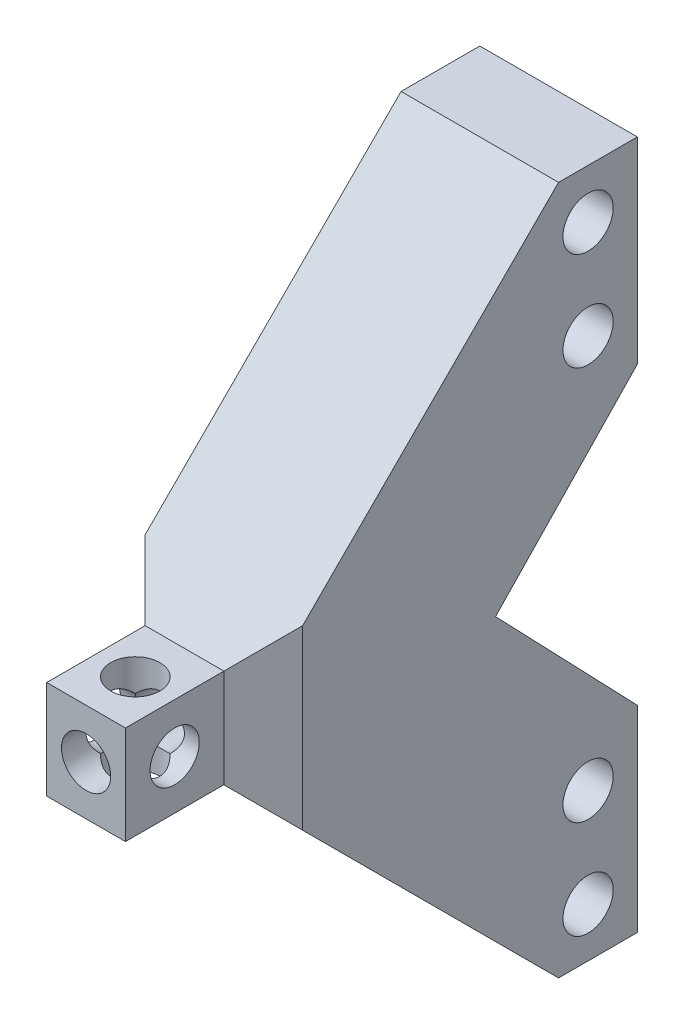
ISO-10303-21;
HEADER;
FILE_DESCRIPTION(('STEP AP214'),'2;1');
FILE_NAME('part.step','',(''),(''),'','','');
FILE_SCHEMA(('AUTOMOTIVE_DESIGN { 1 0 10303 214 1 1 1 1 }'));
ENDSEC;
DATA;
#1=APPLICATION_CONTEXT('core data for automotive mechanical design processes');
#2=APPLICATION_PROTOCOL_DEFINITION('international standard','automotive_design',2000,#1);
#3=PRODUCT_CONTEXT('',#1,'mechanical');
#4=PRODUCT('Part','Part','',(#3));
#5=PRODUCT_RELATED_PRODUCT_CATEGORY('part','',(#4));
#6=PRODUCT_DEFINITION_FORMATION('','',#4);
#7=PRODUCT_DEFINITION_CONTEXT('part definition',#1,'design');
#8=PRODUCT_DEFINITION('design','',#6,#7);
#9=PRODUCT_DEFINITION_SHAPE('','',#8);
#10=(LENGTH_UNIT() NAMED_UNIT(*) SI_UNIT(.MILLI.,.METRE.));
#11=(NAMED_UNIT(*) PLANE_ANGLE_UNIT() SI_UNIT($,.RADIAN.));
#12=(NAMED_UNIT(*) SI_UNIT($,.STERADIAN.) SOLID_ANGLE_UNIT());
#13=UNCERTAINTY_MEASURE_WITH_UNIT(LENGTH_MEASURE(1.E-05),#10,'distance_accuracy_value','');
#14=(GEOMETRIC_REPRESENTATION_CONTEXT(3) GLOBAL_UNCERTAINTY_ASSIGNED_CONTEXT((#13)) GLOBAL_UNIT_ASSIGNED_CONTEXT((#10,
#11,#12)) REPRESENTATION_CONTEXT('',''));
#15=CARTESIAN_POINT('',(0.,0.,0.));
#16=DIRECTION('',(0.,0.,1.));
#17=DIRECTION('',(1.,0.,0.));
#18=AXIS2_PLACEMENT_3D('',#15,#16,#17);
#19=CARTESIAN_POINT('',(3.999992,34.99993,42.999914));
#20=DIRECTION('',(-1.,0.,0.));
#21=DIRECTION('',(0.,0.,1.));
#22=AXIS2_PLACEMENT_3D('',#19,#20,#21);
#23=CYLINDRICAL_SURFACE('',#22,2.49999499999998);
#24=CARTESIAN_POINT('',(3.999992,34.99993,42.999914));
#25=DIRECTION('',(-1.,0.,0.));
#26=DIRECTION('',(0.,0.,1.));
#27=AXIS2_PLACEMENT_3D('',#24,#25,#26);
#28=CIRCLE('',#27,2.49999499999998);
#29=CARTESIAN_POINT('',(3.999992,34.99993,45.499909));
#30=VERTEX_POINT('',#29);
#31=EDGE_CURVE('E291',#30,#30,#28,.T.);
#32=ORIENTED_EDGE('',*,*,#31,.T.);
#33=EDGE_LOOP('',(#32));
#34=FACE_BOUND('',#33,.T.);
#35=CARTESIAN_POINT('',(7.999984,34.99993,42.999914));
#36=DIRECTION('',(-0.707106781186547,0.707106781186547,0.));
#37=DIRECTION('',(-0.707106781186547,-0.707106781186547,0.));
#38=AXIS2_PLACEMENT_3D('',#35,#36,#37);
#39=ELLIPSE('',#38,3.53552683486491,2.49999499999999);
#40=CARTESIAN_POINT('',(6.23222058256753,33.2321665825675,44.7676774174325));
#41=VERTEX_POINT('',#40);
#42=CARTESIAN_POINT('',(6.23222058256753,33.2321665825675,41.2321505825675));
#43=VERTEX_POINT('',#42);
#44=EDGE_CURVE('E202',#41,#43,#39,.F.);
#45=ORIENTED_EDGE('',*,*,#44,.T.);
#46=CARTESIAN_POINT('',(7.999984,34.99993,42.999914));
#47=DIRECTION('',(-0.707106781186547,0.,0.707106781186547));
#48=DIRECTION('',(-0.707106781186547,0.,-0.707106781186547));
#49=AXIS2_PLACEMENT_3D('',#46,#47,#48);
#50=ELLIPSE('',#49,3.53552683486497,2.49999500000003);
#51=CARTESIAN_POINT('',(6.23222058256753,36.7676934174325,41.2321505825675));
#52=VERTEX_POINT('',#51);
#53=EDGE_CURVE('E81',#43,#52,#50,.F.);
#54=ORIENTED_EDGE('',*,*,#53,.T.);
#55=CARTESIAN_POINT('',(7.999984,34.99993,42.999914));
#56=DIRECTION('',(-0.707106781186547,-0.707106781186547,0.));
#57=DIRECTION('',(-0.707106781186547,0.707106781186547,0.));
#58=AXIS2_PLACEMENT_3D('',#55,#56,#57);
#59=ELLIPSE('',#58,3.53552683486491,2.49999499999999);
#60=CARTESIAN_POINT('',(6.23222058256753,36.7676934174325,44.7676774174325));
#61=VERTEX_POINT('',#60);
#62=EDGE_CURVE('E219',#52,#61,#59,.F.);
#63=ORIENTED_EDGE('',*,*,#62,.T.);
#64=CARTESIAN_POINT('',(7.999984,34.99993,42.999914));
#65=DIRECTION('',(-0.707106781186547,0.,-0.707106781186547));
#66=DIRECTION('',(-0.707106781186547,0.,0.707106781186547));
#67=AXIS2_PLACEMENT_3D('',#64,#65,#66);
#68=ELLIPSE('',#67,3.53552683486497,2.49999500000003);
#69=EDGE_CURVE('E233',#61,#41,#68,.F.);
#70=ORIENTED_EDGE('',*,*,#69,.T.);
#71=EDGE_LOOP('',(#45,#54,#63,#70));
#72=FACE_BOUND('',#71,.T.);
#73=ADVANCED_FACE('F58',(#34,#72),#23,.F.);
#74=CARTESIAN_POINT('',(0.,0.,0.));
#75=DIRECTION('',(0.,0.,1.));
#76=DIRECTION('',(0.,-1.,0.));
#77=AXIS2_PLACEMENT_3D('',#74,#75,#76);
#78=PLANE('',#77);
#79=DIRECTION('',(0.,-1.,0.));
#80=VECTOR('',#79,1.);
#81=CARTESIAN_POINT('',(15.999968,1.4210854715202E-13,0.));
#82=LINE('',#81,#80);
#83=CARTESIAN_POINT('',(15.999968,69.99986,0.));
#84=VERTEX_POINT('',#83);
#85=CARTESIAN_POINT('',(15.999968,49.9999,0.));
#86=VERTEX_POINT('',#85);
#87=EDGE_CURVE('E335',#84,#86,#82,.T.);
#88=ORIENTED_EDGE('',*,*,#87,.T.);
#89=DIRECTION('',(-1.,0.,0.));
#90=VECTOR('',#89,1.);
#91=CARTESIAN_POINT('',(15.999968,49.9999,0.));
#92=LINE('',#91,#90);
#93=CARTESIAN_POINT('',(0.,49.9999,0.));
#94=VERTEX_POINT('',#93);
#95=EDGE_CURVE('E309',#86,#94,#92,.T.);
#96=ORIENTED_EDGE('',*,*,#95,.T.);
#97=DIRECTION('',(0.,1.,0.));
#98=VECTOR('',#97,1.);
#99=CARTESIAN_POINT('',(0.,69.99986,0.));
#100=LINE('',#99,#98);
#101=CARTESIAN_POINT('',(0.,69.99986,0.));
#102=VERTEX_POINT('',#101);
#103=EDGE_CURVE('E319',#94,#102,#100,.T.);
#104=ORIENTED_EDGE('',*,*,#103,.T.);
#105=DIRECTION('',(1.,0.,0.));
#106=VECTOR('',#105,1.);
#107=CARTESIAN_POINT('',(15.999968,69.99986,0.));
#108=LINE('',#107,#106);
#109=EDGE_CURVE('E331',#102,#84,#108,.T.);
#110=ORIENTED_EDGE('',*,*,#109,.T.);
#111=EDGE_LOOP('',(#88,#96,#104,#110));
#112=FACE_BOUND('',#111,.T.);
#113=ADVANCED_FACE('F505',(#112),#78,.F.);
#114=CARTESIAN_POINT('',(15.999968,34.99993,17.2050538979818));
#115=DIRECTION('',(-1.,0.,0.));
#116=DIRECTION('',(0.,1.,0.));
#117=AXIS2_PLACEMENT_3D('',#114,#115,#116);
#118=PLANE('',#117);
#119=CARTESIAN_POINT('',(15.999968,64.99987,4.99999));
#120=DIRECTION('',(-1.,0.,0.));
#121=DIRECTION('',(0.,0.,1.));
#122=AXIS2_PLACEMENT_3D('',#119,#120,#121);
#123=CIRCLE('',#122,2.55);
#124=CARTESIAN_POINT('',(15.999968,64.99987,7.54999));
#125=VERTEX_POINT('',#124);
#126=EDGE_CURVE('E255',#125,#125,#123,.T.);
#127=ORIENTED_EDGE('',*,*,#126,.T.);
#128=EDGE_LOOP('',(#127));
#129=FACE_BOUND('',#128,.T.);
#130=CARTESIAN_POINT('',(15.999968,54.99989,4.99999));
#131=DIRECTION('',(-1.,0.,0.));
#132=DIRECTION('',(0.,0.,1.));
#133=AXIS2_PLACEMENT_3D('',#130,#131,#132);
#134=CIRCLE('',#133,2.55);
#135=CARTESIAN_POINT('',(15.999968,54.99989,7.54999));
#136=VERTEX_POINT('',#135);
#137=EDGE_CURVE('E263',#136,#136,#134,.T.);
#138=ORIENTED_EDGE('',*,*,#137,.T.);
#139=EDGE_LOOP('',(#138));
#140=FACE_BOUND('',#139,.T.);
#141=CARTESIAN_POINT('',(15.9999680000001,14.99997,4.99999));
#142=DIRECTION('',(-1.,0.,0.));
#143=DIRECTION('',(0.,0.,1.));
#144=AXIS2_PLACEMENT_3D('',#141,#142,#143);
#145=CIRCLE('',#144,2.54999999999999);
#146=CARTESIAN_POINT('',(15.9999680000001,14.99997,7.54998999999999));
#147=VERTEX_POINT('',#146);
#148=EDGE_CURVE('E271',#147,#147,#145,.T.);
#149=ORIENTED_EDGE('',*,*,#148,.T.);
#150=EDGE_LOOP('',(#149));
#151=FACE_BOUND('',#150,.T.);
#152=CARTESIAN_POINT('',(15.9999680000001,4.99999000000017,4.99999));
#153=DIRECTION('',(-1.,0.,0.));
#154=DIRECTION('',(0.,0.,1.));
#155=AXIS2_PLACEMENT_3D('',#152,#153,#154);
#156=CIRCLE('',#155,2.55);
#157=CARTESIAN_POINT('',(15.9999680000001,4.99999000000017,7.54999));
#158=VERTEX_POINT('',#157);
#159=EDGE_CURVE('E279',#158,#158,#156,.T.);
#160=ORIENTED_EDGE('',*,*,#159,.T.);
#161=EDGE_LOOP('',(#160));
#162=FACE_BOUND('',#161,.T.);
#163=DIRECTION('',(0.,0.721387321030951,0.692531828189714));
#164=VECTOR('',#163,1.);
#165=CARTESIAN_POINT('',(15.999968,19.99996,0.));
#166=LINE('',#165,#164);
#167=CARTESIAN_POINT('',(15.999968,19.99996,0.));
#168=VERTEX_POINT('',#167);
#169=CARTESIAN_POINT('',(15.999968,34.99993,14.3999712));
#170=VERTEX_POINT('',#169);
#171=EDGE_CURVE('E304',#168,#170,#166,.T.);
#172=ORIENTED_EDGE('',*,*,#171,.T.);
#173=DIRECTION('',(0.,0.721387321030951,-0.692531828189714));
#174=VECTOR('',#173,1.);
#175=CARTESIAN_POINT('',(15.999968,34.99993,14.3999712));
#176=LINE('',#175,#174);
#177=EDGE_CURVE('E300',#170,#86,#176,.T.);
#178=ORIENTED_EDGE('',*,*,#177,.T.);
#179=ORIENTED_EDGE('',*,*,#87,.F.);
#180=DIRECTION('',(0.,0.,1.));
#181=VECTOR('',#180,1.);
#182=CARTESIAN_POINT('',(15.999968,69.99986,0.));
#183=LINE('',#182,#181);
#184=CARTESIAN_POINT('',(15.999968,69.99986,7.99998399999999));
#185=VERTEX_POINT('',#184);
#186=EDGE_CURVE('E349',#84,#185,#183,.T.);
#187=ORIENTED_EDGE('',*,*,#186,.T.);
#188=DIRECTION('',(0.,-0.707106781186548,0.707106781186547));
#189=VECTOR('',#188,1.);
#190=CARTESIAN_POINT('',(15.999968,39.99992,37.999924));
#191=LINE('',#190,#189);
#192=CARTESIAN_POINT('',(15.999968,43.999912,33.999932));
#193=VERTEX_POINT('',#192);
#194=EDGE_CURVE('E424',#185,#193,#191,.T.);
#195=ORIENTED_EDGE('',*,*,#194,.T.);
#196=DIRECTION('',(0.,1.,0.));
#197=VECTOR('',#196,1.);
#198=CARTESIAN_POINT('',(15.999968,34.99993,33.999932));
#199=LINE('',#198,#197);
#200=CARTESIAN_POINT('',(15.999968,25.999948,33.999932));
#201=VERTEX_POINT('',#200);
#202=EDGE_CURVE('E427',#201,#193,#199,.T.);
#203=ORIENTED_EDGE('',*,*,#202,.F.);
#204=DIRECTION('',(0.,-0.707106781186547,-0.707106781186548));
#205=VECTOR('',#204,1.);
#206=CARTESIAN_POINT('',(15.999968,0.,7.999984));
#207=LINE('',#206,#205);
#208=CARTESIAN_POINT('',(15.999968,1.45661253725393E-13,7.999984));
#209=VERTEX_POINT('',#208);
#210=EDGE_CURVE('E388',#201,#209,#207,.T.);
#211=ORIENTED_EDGE('',*,*,#210,.T.);
#212=DIRECTION('',(0.,0.,1.));
#213=VECTOR('',#212,1.);
#214=CARTESIAN_POINT('',(15.999968,1.4210854715202E-13,0.));
#215=LINE('',#214,#213);
#216=CARTESIAN_POINT('',(15.999968,1.4210854715202E-13,0.));
#217=VERTEX_POINT('',#216);
#218=EDGE_CURVE('E346',#217,#209,#215,.T.);
#219=ORIENTED_EDGE('',*,*,#218,.F.);
#220=EDGE_CURVE('E334',#168,#217,#82,.T.);
#221=ORIENTED_EDGE('',*,*,#220,.F.);
#222=EDGE_LOOP('',(#172,#178,#179,#187,#195,#203,#211,#219,#221));
#223=FACE_BOUND('',#222,.T.);
#224=ADVANCED_FACE('F464',(#129,#140,#151,#162,#223),#118,.F.);
#225=CARTESIAN_POINT('',(0.,34.99993,17.2050538979818));
#226=DIRECTION('',(-1.,0.,0.));
#227=DIRECTION('',(0.,1.,0.));
#228=AXIS2_PLACEMENT_3D('',#225,#226,#227);
#229=PLANE('',#228);
#230=CARTESIAN_POINT('',(0.,64.99987,4.99999));
#231=DIRECTION('',(-1.,0.,0.));
#232=DIRECTION('',(0.,0.,1.));
#233=AXIS2_PLACEMENT_3D('',#230,#231,#232);
#234=CIRCLE('',#233,2.55);
#235=CARTESIAN_POINT('',(0.,64.99987,7.54999));
#236=VERTEX_POINT('',#235);
#237=EDGE_CURVE('E251',#236,#236,#234,.T.);
#238=ORIENTED_EDGE('',*,*,#237,.F.);
#239=EDGE_LOOP('',(#238));
#240=FACE_BOUND('',#239,.T.);
#241=CARTESIAN_POINT('',(0.,54.99989,4.99999));
#242=DIRECTION('',(-1.,0.,0.));
#243=DIRECTION('',(0.,0.,1.));
#244=AXIS2_PLACEMENT_3D('',#241,#242,#243);
#245=CIRCLE('',#244,2.55);
#246=CARTESIAN_POINT('',(0.,54.99989,7.54999));
#247=VERTEX_POINT('',#246);
#248=EDGE_CURVE('E259',#247,#247,#245,.T.);
#249=ORIENTED_EDGE('',*,*,#248,.F.);
#250=EDGE_LOOP('',(#249));
#251=FACE_BOUND('',#250,.T.);
#252=CARTESIAN_POINT('',(0.,14.99997,4.99999));
#253=DIRECTION('',(-1.,0.,0.));
#254=DIRECTION('',(0.,0.,1.));
#255=AXIS2_PLACEMENT_3D('',#252,#253,#254);
#256=CIRCLE('',#255,2.55);
#257=CARTESIAN_POINT('',(0.,14.99997,7.54999));
#258=VERTEX_POINT('',#257);
#259=EDGE_CURVE('E267',#258,#258,#256,.T.);
#260=ORIENTED_EDGE('',*,*,#259,.F.);
#261=EDGE_LOOP('',(#260));
#262=FACE_BOUND('',#261,.T.);
#263=CARTESIAN_POINT('',(0.,4.99999000000017,4.99999));
#264=DIRECTION('',(-1.,0.,0.));
#265=DIRECTION('',(0.,0.,1.));
#266=AXIS2_PLACEMENT_3D('',#263,#264,#265);
#267=CIRCLE('',#266,2.55);
#268=CARTESIAN_POINT('',(0.,4.99999000000017,7.54999));
#269=VERTEX_POINT('',#268);
#270=EDGE_CURVE('E275',#269,#269,#267,.T.);
#271=ORIENTED_EDGE('',*,*,#270,.F.);
#272=EDGE_LOOP('',(#271));
#273=FACE_BOUND('',#272,.T.);
#274=DIRECTION('',(0.,0.721387321030951,-0.692531828189714));
#275=VECTOR('',#274,1.);
#276=CARTESIAN_POINT('',(0.,34.99993,14.3999712));
#277=LINE('',#276,#275);
#278=CARTESIAN_POINT('',(0.,34.99993,14.3999712));
#279=VERTEX_POINT('',#278);
#280=EDGE_CURVE('E299',#279,#94,#277,.T.);
#281=ORIENTED_EDGE('',*,*,#280,.F.);
#282=DIRECTION('',(0.,0.721387321030951,0.692531828189714));
#283=VECTOR('',#282,1.);
#284=CARTESIAN_POINT('',(0.,19.99996,0.));
#285=LINE('',#284,#283);
#286=CARTESIAN_POINT('',(0.,19.99996,0.));
#287=VERTEX_POINT('',#286);
#288=EDGE_CURVE('E305',#287,#279,#285,.T.);
#289=ORIENTED_EDGE('',*,*,#288,.F.);
#290=CARTESIAN_POINT('',(0.,1.4210854715202E-13,0.));
#291=VERTEX_POINT('',#290);
#292=EDGE_CURVE('E327',#291,#287,#100,.T.);
#293=ORIENTED_EDGE('',*,*,#292,.F.);
#294=DIRECTION('',(0.,0.,1.));
#295=VECTOR('',#294,1.);
#296=CARTESIAN_POINT('',(0.,1.4210854715202E-13,0.));
#297=LINE('',#296,#295);
#298=CARTESIAN_POINT('',(0.,1.45661253725393E-13,7.999984));
#299=VERTEX_POINT('',#298);
#300=EDGE_CURVE('E342',#291,#299,#297,.T.);
#301=ORIENTED_EDGE('',*,*,#300,.T.);
#302=DIRECTION('',(0.,0.707106781186547,0.707106781186548));
#303=VECTOR('',#302,1.);
#304=CARTESIAN_POINT('',(0.,0.,7.999984));
#305=LINE('',#304,#303);
#306=CARTESIAN_POINT('',(0.,25.999948,33.999932));
#307=VERTEX_POINT('',#306);
#308=EDGE_CURVE('E387',#299,#307,#305,.T.);
#309=ORIENTED_EDGE('',*,*,#308,.T.);
#310=DIRECTION('',(0.,-1.,0.));
#311=VECTOR('',#310,1.);
#312=CARTESIAN_POINT('',(0.,34.99993,33.999932));
#313=LINE('',#312,#311);
#314=CARTESIAN_POINT('',(0.,43.999912,33.999932));
#315=VERTEX_POINT('',#314);
#316=EDGE_CURVE('E448',#315,#307,#313,.T.);
#317=ORIENTED_EDGE('',*,*,#316,.F.);
#318=DIRECTION('',(0.,0.707106781186548,-0.707106781186547));
#319=VECTOR('',#318,1.);
#320=CARTESIAN_POINT('',(0.,39.99992,37.999924));
#321=LINE('',#320,#319);
#322=CARTESIAN_POINT('',(0.,69.99986,7.99998399999997));
#323=VERTEX_POINT('',#322);
#324=EDGE_CURVE('E442',#315,#323,#321,.T.);
#325=ORIENTED_EDGE('',*,*,#324,.T.);
#326=DIRECTION('',(0.,0.,1.));
#327=VECTOR('',#326,1.);
#328=CARTESIAN_POINT('',(0.,69.99986,0.));
#329=LINE('',#328,#327);
#330=EDGE_CURVE('E352',#102,#323,#329,.T.);
#331=ORIENTED_EDGE('',*,*,#330,.F.);
#332=ORIENTED_EDGE('',*,*,#103,.F.);
#333=EDGE_LOOP('',(#281,#289,#293,#301,#309,#317,#325,#331,#332));
#334=FACE_BOUND('',#333,.T.);
#335=ADVANCED_FACE('F491',(#240,#251,#262,#273,#334),#229,.T.);
#336=CARTESIAN_POINT('',(0.,29.99994,37.999924));
#337=DIRECTION('',(0.,-0.707106781186548,0.707106781186547));
#338=DIRECTION('',(-1.,0.,0.));
#339=AXIS2_PLACEMENT_3D('',#336,#337,#338);
#340=PLANE('',#339);
#341=DIRECTION('',(0.577350269189626,-0.577350269189626,-0.577350269189626));
#342=VECTOR('',#341,1.);
#343=CARTESIAN_POINT('',(9.83331366666664,32.1666023333334,40.1665863333333));
#344=LINE('',#343,#342);
#345=CARTESIAN_POINT('',(11.999976,29.99994,37.999924));
#346=VERTEX_POINT('',#345);
#347=EDGE_CURVE('E432',#346,#201,#344,.T.);
#348=ORIENTED_EDGE('',*,*,#347,.F.);
#349=DIRECTION('',(1.,0.,0.));
#350=VECTOR('',#349,1.);
#351=CARTESIAN_POINT('',(0.,29.99994,37.999924));
#352=LINE('',#351,#350);
#353=CARTESIAN_POINT('',(3.999992,29.99994,37.999924));
#354=VERTEX_POINT('',#353);
#355=EDGE_CURVE('E225',#354,#346,#352,.T.);
#356=ORIENTED_EDGE('',*,*,#355,.F.);
#357=DIRECTION('',(0.577350269189626,0.577350269189626,0.577350269189626));
#358=VECTOR('',#357,1.);
#359=CARTESIAN_POINT('',(3.499993,29.499941,37.499925));
#360=LINE('',#359,#358);
#361=EDGE_CURVE('E404',#307,#354,#360,.T.);
#362=ORIENTED_EDGE('',*,*,#361,.F.);
#363=ORIENTED_EDGE('',*,*,#308,.F.);
#364=DIRECTION('',(1.,0.,0.));
#365=VECTOR('',#364,1.);
#366=CARTESIAN_POINT('',(0.,0.,7.999984));
#367=LINE('',#366,#365);
#368=EDGE_CURVE('E447',#299,#209,#367,.T.);
#369=ORIENTED_EDGE('',*,*,#368,.T.);
#370=ORIENTED_EDGE('',*,*,#210,.F.);
#371=EDGE_LOOP('',(#348,#356,#362,#363,#369,#370));
#372=FACE_BOUND('',#371,.T.);
#373=ADVANCED_FACE('F60',(#372),#340,.T.);
#374=CARTESIAN_POINT('',(1.999996,34.99993,35.999928));
#375=DIRECTION('',(-0.707106781186547,0.,0.707106781186548));
#376=DIRECTION('',(0.,1.,0.));
#377=AXIS2_PLACEMENT_3D('',#374,#375,#376);
#378=PLANE('',#377);
#379=DIRECTION('',(-0.577350269189626,0.577350269189626,-0.577350269189626));
#380=VECTOR('',#379,1.);
#381=CARTESIAN_POINT('',(-6.499987,50.499899,27.499945));
#382=LINE('',#381,#380);
#383=CARTESIAN_POINT('',(3.999992,39.99992,37.999924));
#384=VERTEX_POINT('',#383);
#385=EDGE_CURVE('E405',#384,#315,#382,.T.);
#386=ORIENTED_EDGE('',*,*,#385,.T.);
#387=ORIENTED_EDGE('',*,*,#316,.T.);
#388=ORIENTED_EDGE('',*,*,#361,.T.);
#389=DIRECTION('',(0.,-1.,0.));
#390=VECTOR('',#389,1.);
#391=CARTESIAN_POINT('',(3.999992,29.99994,37.999924));
#392=LINE('',#391,#390);
#393=EDGE_CURVE('E423',#384,#354,#392,.T.);
#394=ORIENTED_EDGE('',*,*,#393,.F.);
#395=EDGE_LOOP('',(#386,#387,#388,#394));
#396=FACE_BOUND('',#395,.T.);
#397=ADVANCED_FACE('F487',(#396),#378,.T.);
#398=CARTESIAN_POINT('',(0.,69.99986,7.999984));
#399=DIRECTION('',(0.,0.707106781186547,0.707106781186548));
#400=DIRECTION('',(1.,0.,0.));
#401=AXIS2_PLACEMENT_3D('',#398,#399,#400);
#402=PLANE('',#401);
#403=DIRECTION('',(-0.577350269189625,-0.577350269189626,0.577350269189626));
#404=VECTOR('',#403,1.);
#405=CARTESIAN_POINT('',(19.8332936666666,47.8332376666667,30.1666063333333));
#406=LINE('',#405,#404);
#407=CARTESIAN_POINT('',(11.999976,39.99992,37.999924));
#408=VERTEX_POINT('',#407);
#409=EDGE_CURVE('E431',#193,#408,#406,.T.);
#410=ORIENTED_EDGE('',*,*,#409,.F.);
#411=ORIENTED_EDGE('',*,*,#194,.F.);
#412=DIRECTION('',(1.,0.,0.));
#413=VECTOR('',#412,1.);
#414=CARTESIAN_POINT('',(0.,69.99986,7.999984));
#415=LINE('',#414,#413);
#416=EDGE_CURVE('E382',#323,#185,#415,.T.);
#417=ORIENTED_EDGE('',*,*,#416,.F.);
#418=ORIENTED_EDGE('',*,*,#324,.F.);
#419=ORIENTED_EDGE('',*,*,#385,.F.);
#420=DIRECTION('',(1.,0.,0.));
#421=VECTOR('',#420,1.);
#422=CARTESIAN_POINT('',(0.,39.99992,37.999924));
#423=LINE('',#422,#421);
#424=EDGE_CURVE('E399',#384,#408,#423,.T.);
#425=ORIENTED_EDGE('',*,*,#424,.T.);
#426=EDGE_LOOP('',(#410,#411,#417,#418,#419,#425));
#427=FACE_BOUND('',#426,.T.);
#428=ADVANCED_FACE('F498',(#427),#402,.T.);
#429=CARTESIAN_POINT('',(13.999972,34.99993,35.999928));
#430=DIRECTION('',(0.707106781186548,0.,0.707106781186548));
#431=DIRECTION('',(0.,-1.,0.));
#432=AXIS2_PLACEMENT_3D('',#429,#430,#431);
#433=PLANE('',#432);
#434=ORIENTED_EDGE('',*,*,#347,.T.);
#435=ORIENTED_EDGE('',*,*,#202,.T.);
#436=ORIENTED_EDGE('',*,*,#409,.T.);
#437=DIRECTION('',(0.,1.,0.));
#438=VECTOR('',#437,1.);
#439=CARTESIAN_POINT('',(11.999976,39.99992,37.999924));
#440=LINE('',#439,#438);
#441=EDGE_CURVE('E712',#346,#408,#440,.T.);
#442=ORIENTED_EDGE('',*,*,#441,.F.);
#443=EDGE_LOOP('',(#434,#435,#436,#442));
#444=FACE_BOUND('',#443,.T.);
#445=ADVANCED_FACE('F718',(#444),#433,.T.);
#446=CARTESIAN_POINT('',(11.999976,29.99994,47.999904));
#447=DIRECTION('',(0.,1.,0.));
#448=DIRECTION('',(0.,0.,1.));
#449=AXIS2_PLACEMENT_3D('',#446,#447,#448);
#450=PLANE('',#449);
#451=CARTESIAN_POINT('',(7.999984,29.99994,42.999914));
#452=DIRECTION('',(0.,1.,0.));
#453=DIRECTION('',(0.,0.,1.));
#454=AXIS2_PLACEMENT_3D('',#451,#452,#453);
#455=CIRCLE('',#454,2.49999499999999);
#456=CARTESIAN_POINT('',(7.999984,29.99994,45.499909));
#457=VERTEX_POINT('',#456);
#458=EDGE_CURVE('E287',#457,#457,#455,.T.);
#459=ORIENTED_EDGE('',*,*,#458,.T.);
#460=EDGE_LOOP('',(#459));
#461=FACE_BOUND('',#460,.T.);
#462=ORIENTED_EDGE('',*,*,#355,.T.);
#463=DIRECTION('',(0.,0.,-1.));
#464=VECTOR('',#463,1.);
#465=CARTESIAN_POINT('',(11.999976,29.99994,47.999904));
#466=LINE('',#465,#464);
#467=CARTESIAN_POINT('',(11.999976,29.99994,47.999904));
#468=VERTEX_POINT('',#467);
#469=EDGE_CURVE('E379',#468,#346,#466,.T.);
#470=ORIENTED_EDGE('',*,*,#469,.F.);
#471=DIRECTION('',(1.,0.,0.));
#472=VECTOR('',#471,1.);
#473=CARTESIAN_POINT('',(11.999976,29.99994,47.999904));
#474=LINE('',#473,#472);
#475=CARTESIAN_POINT('',(3.999992,29.99994,47.999904));
#476=VERTEX_POINT('',#475);
#477=EDGE_CURVE('E355',#476,#468,#474,.T.);
#478=ORIENTED_EDGE('',*,*,#477,.F.);
#479=DIRECTION('',(0.,0.,-1.));
#480=VECTOR('',#479,1.);
#481=CARTESIAN_POINT('',(3.999992,29.99994,47.999904));
#482=LINE('',#481,#480);
#483=EDGE_CURVE('E368',#476,#354,#482,.T.);
#484=ORIENTED_EDGE('',*,*,#483,.T.);
#485=EDGE_LOOP('',(#462,#470,#478,#484));
#486=FACE_BOUND('',#485,.T.);
#487=ADVANCED_FACE('F706',(#461,#486),#450,.F.);
#488=CARTESIAN_POINT('',(11.999976,39.99992,47.999904));
#489=DIRECTION('',(-1.,0.,0.));
#490=DIRECTION('',(0.,0.,1.));
#491=AXIS2_PLACEMENT_3D('',#488,#489,#490);
#492=PLANE('',#491);
#493=CARTESIAN_POINT('',(11.999976,34.99993,42.999914));
#494=DIRECTION('',(-1.,0.,0.));
#495=DIRECTION('',(0.,0.,1.));
#496=AXIS2_PLACEMENT_3D('',#493,#494,#495);
#497=CIRCLE('',#496,2.49999499999998);
#498=CARTESIAN_POINT('',(11.999976,34.99993,45.499909));
#499=VERTEX_POINT('',#498);
#500=EDGE_CURVE('E295',#499,#499,#497,.T.);
#501=ORIENTED_EDGE('',*,*,#500,.T.);
#502=EDGE_LOOP('',(#501));
#503=FACE_BOUND('',#502,.T.);
#504=ORIENTED_EDGE('',*,*,#441,.T.);
#505=DIRECTION('',(0.,0.,-1.));
#506=VECTOR('',#505,1.);
#507=CARTESIAN_POINT('',(11.999976,39.99992,47.999904));
#508=LINE('',#507,#506);
#509=CARTESIAN_POINT('',(11.999976,39.99992,47.999904));
#510=VERTEX_POINT('',#509);
#511=EDGE_CURVE('E376',#510,#408,#508,.T.);
#512=ORIENTED_EDGE('',*,*,#511,.F.);
#513=DIRECTION('',(0.,1.,0.));
#514=VECTOR('',#513,1.);
#515=CARTESIAN_POINT('',(11.999976,39.99992,47.999904));
#516=LINE('',#515,#514);
#517=EDGE_CURVE('E359',#468,#510,#516,.T.);
#518=ORIENTED_EDGE('',*,*,#517,.F.);
#519=ORIENTED_EDGE('',*,*,#469,.T.);
#520=EDGE_LOOP('',(#504,#512,#518,#519));
#521=FACE_BOUND('',#520,.T.);
#522=ADVANCED_FACE('F711',(#503,#521),#492,.F.);
#523=CARTESIAN_POINT('',(3.999992,39.99992,47.999904));
#524=DIRECTION('',(0.,-1.,0.));
#525=DIRECTION('',(0.,0.,-1.));
#526=AXIS2_PLACEMENT_3D('',#523,#524,#525);
#527=PLANE('',#526);
#528=CARTESIAN_POINT('',(7.999984,39.99992,42.999914));
#529=DIRECTION('',(0.,1.,0.));
#530=DIRECTION('',(0.,0.,1.));
#531=AXIS2_PLACEMENT_3D('',#528,#529,#530);
#532=CIRCLE('',#531,2.49999499999999);
#533=CARTESIAN_POINT('',(7.999984,39.99992,45.499909));
#534=VERTEX_POINT('',#533);
#535=EDGE_CURVE('E283',#534,#534,#532,.T.);
#536=ORIENTED_EDGE('',*,*,#535,.F.);
#537=EDGE_LOOP('',(#536));
#538=FACE_BOUND('',#537,.T.);
#539=ORIENTED_EDGE('',*,*,#424,.F.);
#540=DIRECTION('',(0.,0.,-1.));
#541=VECTOR('',#540,1.);
#542=CARTESIAN_POINT('',(3.999992,39.99992,47.999904));
#543=LINE('',#542,#541);
#544=CARTESIAN_POINT('',(3.999992,39.99992,47.999904));
#545=VERTEX_POINT('',#544);
#546=EDGE_CURVE('E372',#545,#384,#543,.T.);
#547=ORIENTED_EDGE('',*,*,#546,.F.);
#548=DIRECTION('',(-1.,0.,0.));
#549=VECTOR('',#548,1.);
#550=CARTESIAN_POINT('',(3.999992,39.99992,47.999904));
#551=LINE('',#550,#549);
#552=EDGE_CURVE('E362',#510,#545,#551,.T.);
#553=ORIENTED_EDGE('',*,*,#552,.F.);
#554=ORIENTED_EDGE('',*,*,#511,.T.);
#555=EDGE_LOOP('',(#539,#547,#553,#554));
#556=FACE_BOUND('',#555,.T.);
#557=ADVANCED_FACE('F716',(#538,#556),#527,.F.);
#558=CARTESIAN_POINT('',(3.999992,29.99994,47.999904));
#559=DIRECTION('',(1.,0.,0.));
#560=DIRECTION('',(0.,0.,-1.));
#561=AXIS2_PLACEMENT_3D('',#558,#559,#560);
#562=PLANE('',#561);
#563=ORIENTED_EDGE('',*,*,#31,.F.);
#564=EDGE_LOOP('',(#563));
#565=FACE_BOUND('',#564,.T.);
#566=ORIENTED_EDGE('',*,*,#393,.T.);
#567=ORIENTED_EDGE('',*,*,#483,.F.);
#568=DIRECTION('',(0.,-1.,0.));
#569=VECTOR('',#568,1.);
#570=CARTESIAN_POINT('',(3.999992,29.99994,47.999904));
#571=LINE('',#570,#569);
#572=EDGE_CURVE('E365',#545,#476,#571,.T.);
#573=ORIENTED_EDGE('',*,*,#572,.F.);
#574=ORIENTED_EDGE('',*,*,#546,.T.);
#575=EDGE_LOOP('',(#566,#567,#573,#574));
#576=FACE_BOUND('',#575,.T.);
#577=ADVANCED_FACE('F557',(#565,#576),#562,.F.);
#578=CARTESIAN_POINT('',(0.,0.,47.999904));
#579=DIRECTION('',(0.,0.,-1.));
#580=DIRECTION('',(-1.,0.,0.));
#581=AXIS2_PLACEMENT_3D('',#578,#579,#580);
#582=PLANE('',#581);
#583=CARTESIAN_POINT('',(7.999984,34.99993,47.999904));
#584=DIRECTION('',(0.,0.,1.));
#585=DIRECTION('',(1.,0.,0.));
#586=AXIS2_PLACEMENT_3D('',#583,#584,#585);
#587=CIRCLE('',#586,2.49999500000008);
#588=CARTESIAN_POINT('',(10.4999790000001,34.99993,47.999904));
#589=VERTEX_POINT('',#588);
#590=EDGE_CURVE('E214',#589,#589,#587,.T.);
#591=ORIENTED_EDGE('',*,*,#590,.F.);
#592=EDGE_LOOP('',(#591));
#593=FACE_BOUND('',#592,.T.);
#594=ORIENTED_EDGE('',*,*,#477,.T.);
#595=ORIENTED_EDGE('',*,*,#517,.T.);
#596=ORIENTED_EDGE('',*,*,#552,.T.);
#597=ORIENTED_EDGE('',*,*,#572,.T.);
#598=EDGE_LOOP('',(#594,#595,#596,#597));
#599=FACE_BOUND('',#598,.T.);
#600=ADVANCED_FACE('F527',(#593,#599),#582,.F.);
#601=CARTESIAN_POINT('',(15.999968,69.99986,0.));
#602=DIRECTION('',(0.,-1.,0.));
#603=DIRECTION('',(0.,0.,-1.));
#604=AXIS2_PLACEMENT_3D('',#601,#602,#603);
#605=PLANE('',#604);
#606=ORIENTED_EDGE('',*,*,#416,.T.);
#607=ORIENTED_EDGE('',*,*,#186,.F.);
#608=ORIENTED_EDGE('',*,*,#109,.F.);
#609=ORIENTED_EDGE('',*,*,#330,.T.);
#610=EDGE_LOOP('',(#606,#607,#608,#609));
#611=FACE_BOUND('',#610,.T.);
#612=ADVANCED_FACE('F501',(#611),#605,.F.);
#613=CARTESIAN_POINT('',(0.,1.4210854715202E-13,0.));
#614=DIRECTION('',(0.,1.,0.));
#615=DIRECTION('',(0.,0.,1.));
#616=AXIS2_PLACEMENT_3D('',#613,#614,#615);
#617=PLANE('',#616);
#618=ORIENTED_EDGE('',*,*,#368,.F.);
#619=ORIENTED_EDGE('',*,*,#300,.F.);
#620=DIRECTION('',(-1.,0.,0.));
#621=VECTOR('',#620,1.);
#622=CARTESIAN_POINT('',(0.,1.4210854715202E-13,0.));
#623=LINE('',#622,#621);
#624=EDGE_CURVE('E339',#217,#291,#623,.T.);
#625=ORIENTED_EDGE('',*,*,#624,.F.);
#626=ORIENTED_EDGE('',*,*,#218,.T.);
#627=EDGE_LOOP('',(#618,#619,#625,#626));
#628=FACE_BOUND('',#627,.T.);
#629=ADVANCED_FACE('F518',(#628),#617,.F.);
#630=ORIENTED_EDGE('',*,*,#292,.T.);
#631=DIRECTION('',(-1.,0.,0.));
#632=VECTOR('',#631,1.);
#633=CARTESIAN_POINT('',(15.999968,19.99996,0.));
#634=LINE('',#633,#632);
#635=EDGE_CURVE('E321',#168,#287,#634,.T.);
#636=ORIENTED_EDGE('',*,*,#635,.F.);
#637=ORIENTED_EDGE('',*,*,#220,.T.);
#638=ORIENTED_EDGE('',*,*,#624,.T.);
#639=EDGE_LOOP('',(#630,#636,#637,#638));
#640=FACE_BOUND('',#639,.T.);
#641=ADVANCED_FACE('F517',(#640),#78,.F.);
#642=CARTESIAN_POINT('',(15.999968,34.99993,14.3999712));
#643=DIRECTION('',(0.,0.692531828189714,0.721387321030951));
#644=DIRECTION('',(0.,-0.721387321030951,0.692531828189714));
#645=AXIS2_PLACEMENT_3D('',#642,#643,#644);
#646=PLANE('',#645);
#647=DIRECTION('',(-1.,0.,0.));
#648=VECTOR('',#647,1.);
#649=CARTESIAN_POINT('',(15.999968,34.99993,14.3999712));
#650=LINE('',#649,#648);
#651=CARTESIAN_POINT('',(10.4999790000001,34.99993,14.3999712));
#652=VERTEX_POINT('',#651);
#653=EDGE_CURVE('E315',#170,#652,#650,.T.);
#654=ORIENTED_EDGE('',*,*,#653,.T.);
#655=CARTESIAN_POINT('',(7.999984,34.99993,14.3999712));
#656=DIRECTION('',(0.,0.692531828189714,0.721387321030951));
#657=DIRECTION('',(0.,-0.721387321030951,0.692531828189714));
#658=AXIS2_PLACEMENT_3D('',#655,#656,#657);
#659=ELLIPSE('',#658,3.46553775914341,2.49999500000007);
#660=CARTESIAN_POINT('',(5.49998899999993,34.99993,14.3999712));
#661=VERTEX_POINT('',#660);
#662=EDGE_CURVE('E73',#652,#661,#659,.T.);
#663=ORIENTED_EDGE('',*,*,#662,.T.);
#664=EDGE_CURVE('E320',#661,#279,#650,.T.);
#665=ORIENTED_EDGE('',*,*,#664,.T.);
#666=ORIENTED_EDGE('',*,*,#280,.T.);
#667=ORIENTED_EDGE('',*,*,#95,.F.);
#668=ORIENTED_EDGE('',*,*,#177,.F.);
#669=EDGE_LOOP('',(#654,#663,#665,#666,#667,#668));
#670=FACE_BOUND('',#669,.T.);
#671=ADVANCED_FACE('F510',(#670),#646,.F.);
#672=CARTESIAN_POINT('',(15.999968,19.99996,0.));
#673=DIRECTION('',(0.,-0.692531828189714,0.721387321030951));
#674=DIRECTION('',(0.,-0.721387321030951,-0.692531828189714));
#675=AXIS2_PLACEMENT_3D('',#672,#673,#674);
#676=PLANE('',#675);
#677=ORIENTED_EDGE('',*,*,#664,.F.);
#678=CARTESIAN_POINT('',(7.999984,34.99993,14.3999712));
#679=DIRECTION('',(0.,-0.692531828189714,0.721387321030951));
#680=DIRECTION('',(0.,0.721387321030951,0.692531828189714));
#681=AXIS2_PLACEMENT_3D('',#678,#679,#680);
#682=ELLIPSE('',#681,3.46553775914341,2.49999500000007);
#683=EDGE_CURVE('E242',#661,#652,#682,.T.);
#684=ORIENTED_EDGE('',*,*,#683,.T.);
#685=ORIENTED_EDGE('',*,*,#653,.F.);
#686=ORIENTED_EDGE('',*,*,#171,.F.);
#687=ORIENTED_EDGE('',*,*,#635,.T.);
#688=ORIENTED_EDGE('',*,*,#288,.T.);
#689=EDGE_LOOP('',(#677,#684,#685,#686,#687,#688));
#690=FACE_BOUND('',#689,.T.);
#691=ADVANCED_FACE('F513',(#690),#676,.F.);
#692=CARTESIAN_POINT('',(7.999984,34.99993,42.999914));
#693=DIRECTION('',(-0.707106781186547,-0.707106781186547,0.));
#694=DIRECTION('',(-0.707106781186547,0.707106781186547,0.));
#695=AXIS2_PLACEMENT_3D('',#692,#693,#694);
#696=ELLIPSE('',#695,3.53552683486491,2.49999499999999);
#697=CARTESIAN_POINT('',(9.76774741743247,33.2321665825675,41.2321505825675));
#698=VERTEX_POINT('',#697);
#699=CARTESIAN_POINT('',(9.76774741743247,33.2321665825675,44.7676774174325));
#700=VERTEX_POINT('',#699);
#701=EDGE_CURVE('E209',#698,#700,#696,.T.);
#702=ORIENTED_EDGE('',*,*,#701,.T.);
#703=CARTESIAN_POINT('',(7.999984,34.99993,42.999914));
#704=DIRECTION('',(-0.707106781186547,0.,0.707106781186547));
#705=DIRECTION('',(-0.707106781186547,0.,-0.707106781186547));
#706=AXIS2_PLACEMENT_3D('',#703,#704,#705);
#707=ELLIPSE('',#706,3.53552683486497,2.49999500000003);
#708=CARTESIAN_POINT('',(9.76774741743247,36.7676934174325,44.7676774174325));
#709=VERTEX_POINT('',#708);
#710=EDGE_CURVE('E238',#700,#709,#707,.T.);
#711=ORIENTED_EDGE('',*,*,#710,.T.);
#712=CARTESIAN_POINT('',(7.999984,34.99993,42.999914));
#713=DIRECTION('',(-0.707106781186547,0.707106781186547,0.));
#714=DIRECTION('',(-0.707106781186547,-0.707106781186547,0.));
#715=AXIS2_PLACEMENT_3D('',#712,#713,#714);
#716=ELLIPSE('',#715,3.53552683486491,2.49999499999999);
#717=CARTESIAN_POINT('',(9.76774741743247,36.7676934174325,41.2321505825675));
#718=VERTEX_POINT('',#717);
#719=EDGE_CURVE('E211',#709,#718,#716,.T.);
#720=ORIENTED_EDGE('',*,*,#719,.T.);
#721=CARTESIAN_POINT('',(7.999984,34.99993,42.999914));
#722=DIRECTION('',(-0.707106781186547,0.,-0.707106781186547));
#723=DIRECTION('',(-0.707106781186547,0.,0.707106781186547));
#724=AXIS2_PLACEMENT_3D('',#721,#722,#723);
#725=ELLIPSE('',#724,3.53552683486497,2.49999500000003);
#726=EDGE_CURVE('E195',#718,#698,#725,.T.);
#727=ORIENTED_EDGE('',*,*,#726,.T.);
#728=EDGE_LOOP('',(#702,#711,#720,#727));
#729=FACE_BOUND('',#728,.T.);
#730=ORIENTED_EDGE('',*,*,#500,.F.);
#731=EDGE_LOOP('',(#730));
#732=FACE_BOUND('',#731,.T.);
#733=ADVANCED_FACE('F206',(#729,#732),#23,.F.);
#734=CARTESIAN_POINT('',(7.999984,39.99992,42.999914));
#735=DIRECTION('',(0.,1.,0.));
#736=DIRECTION('',(0.,0.,1.));
#737=AXIS2_PLACEMENT_3D('',#734,#735,#736);
#738=CYLINDRICAL_SURFACE('',#737,2.49999499999999);
#739=ORIENTED_EDGE('',*,*,#535,.T.);
#740=EDGE_LOOP('',(#739));
#741=FACE_BOUND('',#740,.T.);
#742=ORIENTED_EDGE('',*,*,#62,.F.);
#743=CARTESIAN_POINT('',(7.999984,34.99993,42.999914));
#744=DIRECTION('',(0.,0.707106781186547,0.707106781186547));
#745=DIRECTION('',(0.,0.707106781186547,-0.707106781186547));
#746=AXIS2_PLACEMENT_3D('',#743,#744,#745);
#747=ELLIPSE('',#746,3.53552683486497,2.49999500000003);
#748=EDGE_CURVE('E213',#52,#718,#747,.F.);
#749=ORIENTED_EDGE('',*,*,#748,.T.);
#750=ORIENTED_EDGE('',*,*,#719,.F.);
#751=CARTESIAN_POINT('',(7.999984,34.99993,42.999914));
#752=DIRECTION('',(0.,0.707106781186547,-0.707106781186547));
#753=DIRECTION('',(0.,0.707106781186547,0.707106781186547));
#754=AXIS2_PLACEMENT_3D('',#751,#752,#753);
#755=ELLIPSE('',#754,3.53552683486497,2.49999500000003);
#756=EDGE_CURVE('E237',#709,#61,#755,.F.);
#757=ORIENTED_EDGE('',*,*,#756,.T.);
#758=EDGE_LOOP('',(#742,#749,#750,#757));
#759=FACE_BOUND('',#758,.T.);
#760=ADVANCED_FACE('F539',(#741,#759),#738,.F.);
#761=ORIENTED_EDGE('',*,*,#44,.F.);
#762=CARTESIAN_POINT('',(7.999984,34.99993,42.999914));
#763=DIRECTION('',(0.,0.707106781186547,0.707106781186547));
#764=DIRECTION('',(0.,0.707106781186547,-0.707106781186547));
#765=AXIS2_PLACEMENT_3D('',#762,#763,#764);
#766=ELLIPSE('',#765,3.53552683486497,2.49999500000003);
#767=EDGE_CURVE('E12',#41,#700,#766,.T.);
#768=ORIENTED_EDGE('',*,*,#767,.T.);
#769=ORIENTED_EDGE('',*,*,#701,.F.);
#770=CARTESIAN_POINT('',(7.999984,34.99993,42.999914));
#771=DIRECTION('',(0.,0.707106781186547,-0.707106781186547));
#772=DIRECTION('',(0.,0.707106781186547,0.707106781186547));
#773=AXIS2_PLACEMENT_3D('',#770,#771,#772);
#774=ELLIPSE('',#773,3.53552683486497,2.49999500000003);
#775=EDGE_CURVE('E67',#698,#43,#774,.T.);
#776=ORIENTED_EDGE('',*,*,#775,.T.);
#777=EDGE_LOOP('',(#761,#768,#769,#776));
#778=FACE_BOUND('',#777,.T.);
#779=ORIENTED_EDGE('',*,*,#458,.F.);
#780=EDGE_LOOP('',(#779));
#781=FACE_BOUND('',#780,.T.);
#782=ADVANCED_FACE('F216',(#778,#781),#738,.F.);
#783=CARTESIAN_POINT('',(0.,4.99999000000017,4.99999));
#784=DIRECTION('',(-1.,0.,0.));
#785=DIRECTION('',(0.,0.,1.));
#786=AXIS2_PLACEMENT_3D('',#783,#784,#785);
#787=CYLINDRICAL_SURFACE('',#786,2.55);
#788=ORIENTED_EDGE('',*,*,#159,.F.);
#789=EDGE_LOOP('',(#788));
#790=FACE_BOUND('',#789,.T.);
#791=ORIENTED_EDGE('',*,*,#270,.T.);
#792=EDGE_LOOP('',(#791));
#793=FACE_BOUND('',#792,.T.);
#794=ADVANCED_FACE('F638',(#790,#793),#787,.F.);
#795=CARTESIAN_POINT('',(0.,14.99997,4.99999));
#796=DIRECTION('',(-1.,0.,0.));
#797=DIRECTION('',(0.,0.,1.));
#798=AXIS2_PLACEMENT_3D('',#795,#796,#797);
#799=CYLINDRICAL_SURFACE('',#798,2.55);
#800=ORIENTED_EDGE('',*,*,#148,.F.);
#801=EDGE_LOOP('',(#800));
#802=FACE_BOUND('',#801,.T.);
#803=ORIENTED_EDGE('',*,*,#259,.T.);
#804=EDGE_LOOP('',(#803));
#805=FACE_BOUND('',#804,.T.);
#806=ADVANCED_FACE('F644',(#802,#805),#799,.F.);
#807=CARTESIAN_POINT('',(0.,54.99989,4.99999));
#808=DIRECTION('',(-1.,0.,0.));
#809=DIRECTION('',(0.,0.,1.));
#810=AXIS2_PLACEMENT_3D('',#807,#808,#809);
#811=CYLINDRICAL_SURFACE('',#810,2.55);
#812=ORIENTED_EDGE('',*,*,#137,.F.);
#813=EDGE_LOOP('',(#812));
#814=FACE_BOUND('',#813,.T.);
#815=ORIENTED_EDGE('',*,*,#248,.T.);
#816=EDGE_LOOP('',(#815));
#817=FACE_BOUND('',#816,.T.);
#818=ADVANCED_FACE('F653',(#814,#817),#811,.F.);
#819=CARTESIAN_POINT('',(0.,64.99987,4.99999));
#820=DIRECTION('',(-1.,0.,0.));
#821=DIRECTION('',(0.,0.,1.));
#822=AXIS2_PLACEMENT_3D('',#819,#820,#821);
#823=CYLINDRICAL_SURFACE('',#822,2.55);
#824=ORIENTED_EDGE('',*,*,#126,.F.);
#825=EDGE_LOOP('',(#824));
#826=FACE_BOUND('',#825,.T.);
#827=ORIENTED_EDGE('',*,*,#237,.T.);
#828=EDGE_LOOP('',(#827));
#829=FACE_BOUND('',#828,.T.);
#830=ADVANCED_FACE('F662',(#826,#829),#823,.F.);
#831=CARTESIAN_POINT('',(7.999984,34.99993,47.999904));
#832=DIRECTION('',(0.,0.,1.));
#833=DIRECTION('',(1.,0.,0.));
#834=AXIS2_PLACEMENT_3D('',#831,#832,#833);
#835=CYLINDRICAL_SURFACE('',#834,2.49999500000007);
#836=ORIENTED_EDGE('',*,*,#775,.F.);
#837=ORIENTED_EDGE('',*,*,#726,.F.);
#838=ORIENTED_EDGE('',*,*,#748,.F.);
#839=ORIENTED_EDGE('',*,*,#53,.F.);
#840=EDGE_LOOP('',(#836,#837,#838,#839));
#841=FACE_BOUND('',#840,.T.);
#842=ORIENTED_EDGE('',*,*,#683,.F.);
#843=ORIENTED_EDGE('',*,*,#662,.F.);
#844=EDGE_LOOP('',(#842,#843));
#845=FACE_BOUND('',#844,.T.);
#846=ADVANCED_FACE('F194',(#841,#845),#835,.F.);
#847=ORIENTED_EDGE('',*,*,#590,.T.);
#848=EDGE_LOOP('',(#847));
#849=FACE_BOUND('',#848,.T.);
#850=ORIENTED_EDGE('',*,*,#710,.F.);
#851=ORIENTED_EDGE('',*,*,#767,.F.);
#852=ORIENTED_EDGE('',*,*,#69,.F.);
#853=ORIENTED_EDGE('',*,*,#756,.F.);
#854=EDGE_LOOP('',(#850,#851,#852,#853));
#855=FACE_BOUND('',#854,.T.);
#856=ADVANCED_FACE('F678',(#849,#855),#835,.F.);
#857=CLOSED_SHELL('',(#73,#113,#224,#335,#373,#397,#428,#445,#487,#522,#557,#577,#600,#612,#629,
#641,#671,#691,#733,#760,#782,#794,#806,#818,#830,#846,#856));
#858=MANIFOLD_SOLID_BREP('B2',#857);
#859=ADVANCED_BREP_SHAPE_REPRESENTATION('',(#18,#858),#14);
#860=SHAPE_DEFINITION_REPRESENTATION(#9,#859);
ENDSEC;
END-ISO-10303-21;
